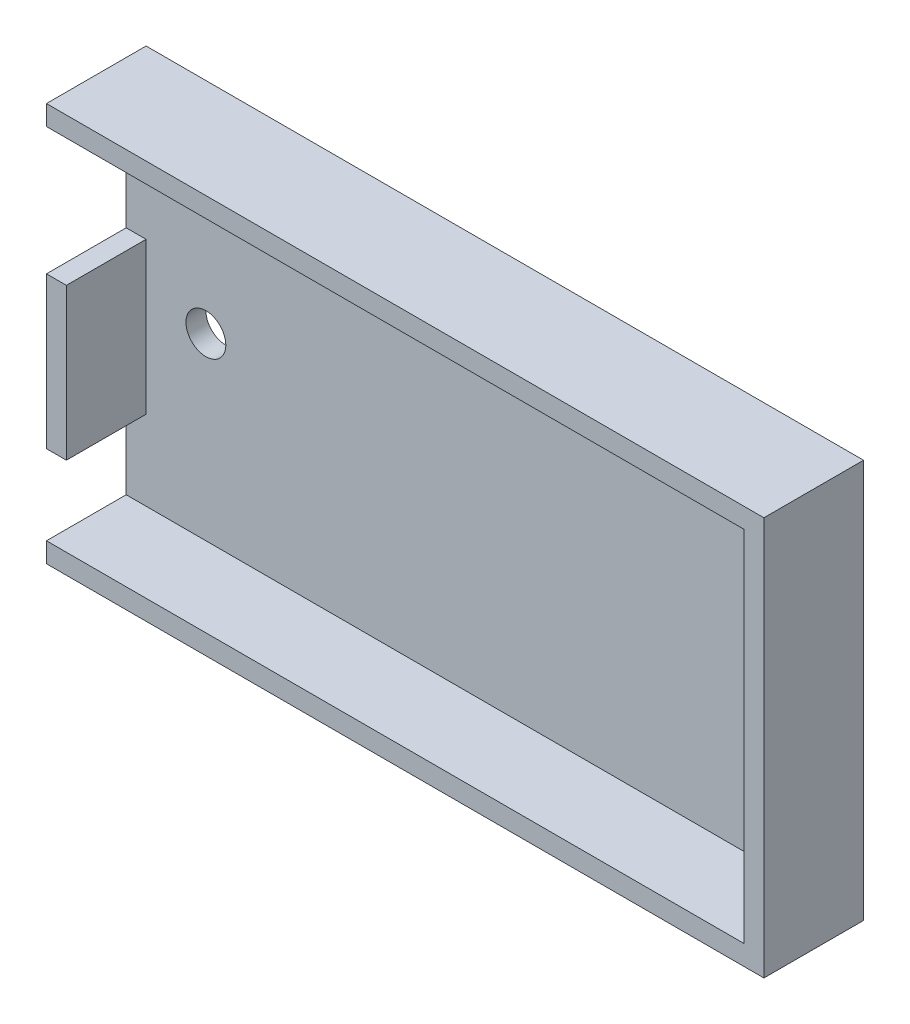
ISO-10303-21;
HEADER;
FILE_DESCRIPTION(('STEP AP214'),'2;1');
FILE_NAME('part.step','',(''),(''),'','','');
FILE_SCHEMA(('AUTOMOTIVE_DESIGN { 1 0 10303 214 1 1 1 1 }'));
ENDSEC;
DATA;
#1=APPLICATION_CONTEXT('core data for automotive mechanical design processes');
#2=APPLICATION_PROTOCOL_DEFINITION('international standard','automotive_design',2000,#1);
#3=PRODUCT_CONTEXT('',#1,'mechanical');
#4=PRODUCT('Part','Part','',(#3));
#5=PRODUCT_RELATED_PRODUCT_CATEGORY('part','',(#4));
#6=PRODUCT_DEFINITION_FORMATION('','',#4);
#7=PRODUCT_DEFINITION_CONTEXT('part definition',#1,'design');
#8=PRODUCT_DEFINITION('design','',#6,#7);
#9=PRODUCT_DEFINITION_SHAPE('','',#8);
#10=(LENGTH_UNIT() NAMED_UNIT(*) SI_UNIT(.MILLI.,.METRE.));
#11=(NAMED_UNIT(*) PLANE_ANGLE_UNIT() SI_UNIT($,.RADIAN.));
#12=(NAMED_UNIT(*) SI_UNIT($,.STERADIAN.) SOLID_ANGLE_UNIT());
#13=UNCERTAINTY_MEASURE_WITH_UNIT(LENGTH_MEASURE(1.E-05),#10,'distance_accuracy_value','');
#14=(GEOMETRIC_REPRESENTATION_CONTEXT(3) GLOBAL_UNCERTAINTY_ASSIGNED_CONTEXT((#13)) GLOBAL_UNIT_ASSIGNED_CONTEXT((#10,
#11,#12)) REPRESENTATION_CONTEXT('',''));
#15=CARTESIAN_POINT('',(0.,0.,0.));
#16=DIRECTION('',(0.,0.,1.));
#17=DIRECTION('',(1.,0.,0.));
#18=AXIS2_PLACEMENT_3D('',#15,#16,#17);
#19=CARTESIAN_POINT('',(0.,0.,15.875));
#20=DIRECTION('',(0.,0.,1.));
#21=DIRECTION('',(1.,0.,0.));
#22=AXIS2_PLACEMENT_3D('',#19,#20,#21);
#23=PLANE('',#22);
#24=DIRECTION('',(-1.,0.,0.));
#25=VECTOR('',#24,1.);
#26=CARTESIAN_POINT('',(57.151,-15.875,15.875));
#27=LINE('',#26,#25);
#28=CARTESIAN_POINT('',(-53.975,-15.875,15.875));
#29=VERTEX_POINT('',#28);
#30=CARTESIAN_POINT('',(-57.15,-15.875,15.875));
#31=VERTEX_POINT('',#30);
#32=EDGE_CURVE('E128',#29,#31,#27,.T.);
#33=ORIENTED_EDGE('',*,*,#32,.F.);
#34=DIRECTION('',(0.,-1.,0.));
#35=VECTOR('',#34,1.);
#36=CARTESIAN_POINT('',(-53.975,28.575,15.875));
#37=LINE('',#36,#35);
#38=CARTESIAN_POINT('',(-53.975,8.255,15.875));
#39=VERTEX_POINT('',#38);
#40=EDGE_CURVE('E140',#39,#29,#37,.T.);
#41=ORIENTED_EDGE('',*,*,#40,.F.);
#42=DIRECTION('',(-1.,0.,0.));
#43=VECTOR('',#42,1.);
#44=CARTESIAN_POINT('',(57.151,8.255,15.875));
#45=LINE('',#44,#43);
#46=CARTESIAN_POINT('',(-57.15,8.255,15.875));
#47=VERTEX_POINT('',#46);
#48=EDGE_CURVE('E234',#39,#47,#45,.T.);
#49=ORIENTED_EDGE('',*,*,#48,.T.);
#50=DIRECTION('',(0.,-1.,0.));
#51=VECTOR('',#50,1.);
#52=CARTESIAN_POINT('',(-57.15,31.75,15.875));
#53=LINE('',#52,#51);
#54=EDGE_CURVE('E142',#47,#31,#53,.T.);
#55=ORIENTED_EDGE('',*,*,#54,.T.);
#56=EDGE_LOOP('',(#33,#41,#49,#55));
#57=FACE_BOUND('',#56,.T.);
#58=ADVANCED_FACE('F34',(#57),#23,.T.);
#59=CARTESIAN_POINT('',(57.15,-31.75,3.175));
#60=DIRECTION('',(-1.,0.,0.));
#61=DIRECTION('',(0.,0.,1.));
#62=AXIS2_PLACEMENT_3D('',#59,#60,#61);
#63=PLANE('',#62);
#64=DIRECTION('',(0.,1.,0.));
#65=VECTOR('',#64,1.);
#66=CARTESIAN_POINT('',(57.15,-31.75,0.));
#67=LINE('',#66,#65);
#68=CARTESIAN_POINT('',(57.15,-31.75,0.));
#69=VERTEX_POINT('',#68);
#70=CARTESIAN_POINT('',(57.15,31.75,0.));
#71=VERTEX_POINT('',#70);
#72=EDGE_CURVE('E182',#69,#71,#67,.T.);
#73=ORIENTED_EDGE('',*,*,#72,.T.);
#74=DIRECTION('',(0.,0.,-1.));
#75=VECTOR('',#74,1.);
#76=CARTESIAN_POINT('',(57.15,31.75,3.175));
#77=LINE('',#76,#75);
#78=CARTESIAN_POINT('',(57.15,31.75,15.875));
#79=VERTEX_POINT('',#78);
#80=EDGE_CURVE('E11',#79,#71,#77,.T.);
#81=ORIENTED_EDGE('',*,*,#80,.F.);
#82=DIRECTION('',(0.,1.,0.));
#83=VECTOR('',#82,1.);
#84=CARTESIAN_POINT('',(57.15,-31.75,15.875));
#85=LINE('',#84,#83);
#86=CARTESIAN_POINT('',(57.15,-31.75,15.875));
#87=VERTEX_POINT('',#86);
#88=EDGE_CURVE('E176',#87,#79,#85,.T.);
#89=ORIENTED_EDGE('',*,*,#88,.F.);
#90=DIRECTION('',(0.,0.,-1.));
#91=VECTOR('',#90,1.);
#92=CARTESIAN_POINT('',(57.15,-31.75,3.175));
#93=LINE('',#92,#91);
#94=EDGE_CURVE('E190',#87,#69,#93,.T.);
#95=ORIENTED_EDGE('',*,*,#94,.T.);
#96=EDGE_LOOP('',(#73,#81,#89,#95));
#97=FACE_BOUND('',#96,.T.);
#98=ADVANCED_FACE('F36',(#97),#63,.F.);
#99=CARTESIAN_POINT('',(-57.15,31.75,3.175));
#100=DIRECTION('',(0.,-1.,0.));
#101=DIRECTION('',(0.,0.,-1.));
#102=AXIS2_PLACEMENT_3D('',#99,#100,#101);
#103=PLANE('',#102);
#104=DIRECTION('',(-1.,0.,0.));
#105=VECTOR('',#104,1.);
#106=CARTESIAN_POINT('',(-57.15,31.75,0.));
#107=LINE('',#106,#105);
#108=CARTESIAN_POINT('',(-57.15,31.75,0.));
#109=VERTEX_POINT('',#108);
#110=EDGE_CURVE('E185',#71,#109,#107,.T.);
#111=ORIENTED_EDGE('',*,*,#110,.T.);
#112=DIRECTION('',(0.,0.,-1.));
#113=VECTOR('',#112,1.);
#114=CARTESIAN_POINT('',(-57.15,31.75,3.175));
#115=LINE('',#114,#113);
#116=CARTESIAN_POINT('',(-57.15,31.75,15.875));
#117=VERTEX_POINT('',#116);
#118=EDGE_CURVE('E42',#117,#109,#115,.T.);
#119=ORIENTED_EDGE('',*,*,#118,.F.);
#120=DIRECTION('',(-1.,0.,0.));
#121=VECTOR('',#120,1.);
#122=CARTESIAN_POINT('',(57.15,31.75,15.875));
#123=LINE('',#122,#121);
#124=EDGE_CURVE('E179',#79,#117,#123,.T.);
#125=ORIENTED_EDGE('',*,*,#124,.F.);
#126=ORIENTED_EDGE('',*,*,#80,.T.);
#127=EDGE_LOOP('',(#111,#119,#125,#126));
#128=FACE_BOUND('',#127,.T.);
#129=ADVANCED_FACE('F245',(#128),#103,.F.);
#130=CARTESIAN_POINT('',(-57.15,-31.75,3.175));
#131=DIRECTION('',(1.,0.,0.));
#132=DIRECTION('',(0.,0.,-1.));
#133=AXIS2_PLACEMENT_3D('',#130,#131,#132);
#134=PLANE('',#133);
#135=DIRECTION('',(0.,-1.,0.));
#136=VECTOR('',#135,1.);
#137=CARTESIAN_POINT('',(-57.15,-28.575,3.175));
#138=LINE('',#137,#136);
#139=CARTESIAN_POINT('',(-57.15,-15.875,3.175));
#140=VERTEX_POINT('',#139);
#141=CARTESIAN_POINT('',(-57.15,-28.575,3.175));
#142=VERTEX_POINT('',#141);
#143=EDGE_CURVE('E217',#140,#142,#138,.T.);
#144=ORIENTED_EDGE('',*,*,#143,.F.);
#145=DIRECTION('',(0.,0.,-1.));
#146=VECTOR('',#145,1.);
#147=CARTESIAN_POINT('',(-57.15,-15.875,15.875));
#148=LINE('',#147,#146);
#149=EDGE_CURVE('E220',#31,#140,#148,.T.);
#150=ORIENTED_EDGE('',*,*,#149,.F.);
#151=ORIENTED_EDGE('',*,*,#54,.F.);
#152=DIRECTION('',(0.,0.,1.));
#153=VECTOR('',#152,1.);
#154=CARTESIAN_POINT('',(-57.15,8.255,15.875));
#155=LINE('',#154,#153);
#156=CARTESIAN_POINT('',(-57.15,8.255,3.175));
#157=VERTEX_POINT('',#156);
#158=EDGE_CURVE('E232',#157,#47,#155,.T.);
#159=ORIENTED_EDGE('',*,*,#158,.F.);
#160=DIRECTION('',(0.,-1.,0.));
#161=VECTOR('',#160,1.);
#162=CARTESIAN_POINT('',(-57.15,28.575,3.175));
#163=LINE('',#162,#161);
#164=CARTESIAN_POINT('',(-57.15,28.575,3.175));
#165=VERTEX_POINT('',#164);
#166=EDGE_CURVE('E230',#165,#157,#163,.T.);
#167=ORIENTED_EDGE('',*,*,#166,.F.);
#168=DIRECTION('',(0.,0.,-1.));
#169=VECTOR('',#168,1.);
#170=CARTESIAN_POINT('',(-57.15,28.575,15.875));
#171=LINE('',#170,#169);
#172=CARTESIAN_POINT('',(-57.15,28.575,15.875));
#173=VERTEX_POINT('',#172);
#174=EDGE_CURVE('E226',#173,#165,#171,.T.);
#175=ORIENTED_EDGE('',*,*,#174,.F.);
#176=EDGE_CURVE('E170',#117,#173,#53,.T.);
#177=ORIENTED_EDGE('',*,*,#176,.F.);
#178=ORIENTED_EDGE('',*,*,#118,.T.);
#179=DIRECTION('',(0.,-1.,0.));
#180=VECTOR('',#179,1.);
#181=CARTESIAN_POINT('',(-57.15,-31.75,0.));
#182=LINE('',#181,#180);
#183=CARTESIAN_POINT('',(-57.15,-31.75,0.));
#184=VERTEX_POINT('',#183);
#185=EDGE_CURVE('E187',#109,#184,#182,.T.);
#186=ORIENTED_EDGE('',*,*,#185,.T.);
#187=DIRECTION('',(0.,0.,-1.));
#188=VECTOR('',#187,1.);
#189=CARTESIAN_POINT('',(-57.15,-31.75,3.175));
#190=LINE('',#189,#188);
#191=CARTESIAN_POINT('',(-57.15,-31.75,15.875));
#192=VERTEX_POINT('',#191);
#193=EDGE_CURVE('E192',#192,#184,#190,.T.);
#194=ORIENTED_EDGE('',*,*,#193,.F.);
#195=CARTESIAN_POINT('',(-57.15,-28.575,15.875));
#196=VERTEX_POINT('',#195);
#197=EDGE_CURVE('E169',#196,#192,#53,.T.);
#198=ORIENTED_EDGE('',*,*,#197,.F.);
#199=DIRECTION('',(0.,0.,1.));
#200=VECTOR('',#199,1.);
#201=CARTESIAN_POINT('',(-57.15,-28.575,15.875));
#202=LINE('',#201,#200);
#203=EDGE_CURVE('E143',#142,#196,#202,.T.);
#204=ORIENTED_EDGE('',*,*,#203,.F.);
#205=EDGE_LOOP('',(#144,#150,#151,#159,#167,#175,#177,#178,#186,#194,#198,#204));
#206=FACE_BOUND('',#205,.T.);
#207=ADVANCED_FACE('F198',(#206),#134,.F.);
#208=CARTESIAN_POINT('',(-57.15,-31.75,3.175));
#209=DIRECTION('',(0.,1.,0.));
#210=DIRECTION('',(0.,0.,1.));
#211=AXIS2_PLACEMENT_3D('',#208,#209,#210);
#212=PLANE('',#211);
#213=DIRECTION('',(1.,0.,0.));
#214=VECTOR('',#213,1.);
#215=CARTESIAN_POINT('',(-57.15,-31.75,0.));
#216=LINE('',#215,#214);
#217=EDGE_CURVE('E57',#184,#69,#216,.T.);
#218=ORIENTED_EDGE('',*,*,#217,.T.);
#219=ORIENTED_EDGE('',*,*,#94,.F.);
#220=DIRECTION('',(1.,0.,0.));
#221=VECTOR('',#220,1.);
#222=CARTESIAN_POINT('',(-57.15,-31.75,15.875));
#223=LINE('',#222,#221);
#224=EDGE_CURVE('E173',#192,#87,#223,.T.);
#225=ORIENTED_EDGE('',*,*,#224,.F.);
#226=ORIENTED_EDGE('',*,*,#193,.T.);
#227=EDGE_LOOP('',(#218,#219,#225,#226));
#228=FACE_BOUND('',#227,.T.);
#229=ADVANCED_FACE('F209',(#228),#212,.F.);
#230=CARTESIAN_POINT('',(0.,0.,0.));
#231=DIRECTION('',(0.,0.,-1.));
#232=DIRECTION('',(-1.,0.,0.));
#233=AXIS2_PLACEMENT_3D('',#230,#231,#232);
#234=PLANE('',#233);
#235=CARTESIAN_POINT('',(-44.45,0.,0.));
#236=DIRECTION('',(0.,0.,-1.));
#237=DIRECTION('',(-1.,0.,0.));
#238=AXIS2_PLACEMENT_3D('',#235,#236,#237);
#239=CIRCLE('',#238,3.175);
#240=CARTESIAN_POINT('',(-47.625,0.,0.));
#241=VERTEX_POINT('',#240);
#242=EDGE_CURVE('E296',#241,#241,#239,.F.);
#243=ORIENTED_EDGE('',*,*,#242,.T.);
#244=EDGE_LOOP('',(#243));
#245=FACE_BOUND('',#244,.T.);
#246=CARTESIAN_POINT('',(44.45,0.,0.));
#247=DIRECTION('',(0.,0.,-1.));
#248=DIRECTION('',(-1.,0.,0.));
#249=AXIS2_PLACEMENT_3D('',#246,#247,#248);
#250=CIRCLE('',#249,3.17500000000001);
#251=CARTESIAN_POINT('',(41.275,0.,0.));
#252=VERTEX_POINT('',#251);
#253=EDGE_CURVE('E292',#252,#252,#250,.F.);
#254=ORIENTED_EDGE('',*,*,#253,.T.);
#255=EDGE_LOOP('',(#254));
#256=FACE_BOUND('',#255,.T.);
#257=ORIENTED_EDGE('',*,*,#72,.F.);
#258=ORIENTED_EDGE('',*,*,#217,.F.);
#259=ORIENTED_EDGE('',*,*,#185,.F.);
#260=ORIENTED_EDGE('',*,*,#110,.F.);
#261=EDGE_LOOP('',(#257,#258,#259,#260));
#262=FACE_BOUND('',#261,.T.);
#263=ADVANCED_FACE('F205',(#245,#256,#262),#234,.T.);
#264=DIRECTION('',(1.,0.,0.));
#265=VECTOR('',#264,1.);
#266=CARTESIAN_POINT('',(-53.975,-28.575,15.875));
#267=LINE('',#266,#265);
#268=CARTESIAN_POINT('',(53.975,-28.575,15.875));
#269=VERTEX_POINT('',#268);
#270=EDGE_CURVE('E165',#196,#269,#267,.T.);
#271=ORIENTED_EDGE('',*,*,#270,.F.);
#272=ORIENTED_EDGE('',*,*,#197,.T.);
#273=ORIENTED_EDGE('',*,*,#224,.T.);
#274=ORIENTED_EDGE('',*,*,#88,.T.);
#275=ORIENTED_EDGE('',*,*,#124,.T.);
#276=ORIENTED_EDGE('',*,*,#176,.T.);
#277=DIRECTION('',(-1.,0.,0.));
#278=VECTOR('',#277,1.);
#279=CARTESIAN_POINT('',(53.975,28.575,15.875));
#280=LINE('',#279,#278);
#281=CARTESIAN_POINT('',(53.975,28.575,15.875));
#282=VERTEX_POINT('',#281);
#283=EDGE_CURVE('E149',#282,#173,#280,.T.);
#284=ORIENTED_EDGE('',*,*,#283,.F.);
#285=DIRECTION('',(0.,1.,0.));
#286=VECTOR('',#285,1.);
#287=CARTESIAN_POINT('',(53.975,-28.575,15.875));
#288=LINE('',#287,#286);
#289=EDGE_CURVE('E153',#269,#282,#288,.T.);
#290=ORIENTED_EDGE('',*,*,#289,.F.);
#291=EDGE_LOOP('',(#271,#272,#273,#274,#275,#276,#284,#290));
#292=FACE_BOUND('',#291,.T.);
#293=ADVANCED_FACE('F211',(#292),#23,.T.);
#294=CARTESIAN_POINT('',(-53.975,-28.575,15.875));
#295=DIRECTION('',(0.,1.,0.));
#296=DIRECTION('',(0.,0.,1.));
#297=AXIS2_PLACEMENT_3D('',#294,#295,#296);
#298=PLANE('',#297);
#299=DIRECTION('',(1.,0.,0.));
#300=VECTOR('',#299,1.);
#301=CARTESIAN_POINT('',(-53.975,-28.575,3.175));
#302=LINE('',#301,#300);
#303=CARTESIAN_POINT('',(53.975,-28.575,3.175));
#304=VERTEX_POINT('',#303);
#305=EDGE_CURVE('E134',#142,#304,#302,.T.);
#306=ORIENTED_EDGE('',*,*,#305,.F.);
#307=ORIENTED_EDGE('',*,*,#203,.T.);
#308=ORIENTED_EDGE('',*,*,#270,.T.);
#309=DIRECTION('',(0.,0.,-1.));
#310=VECTOR('',#309,1.);
#311=CARTESIAN_POINT('',(53.975,-28.575,15.875));
#312=LINE('',#311,#310);
#313=EDGE_CURVE('E151',#269,#304,#312,.T.);
#314=ORIENTED_EDGE('',*,*,#313,.T.);
#315=EDGE_LOOP('',(#306,#307,#308,#314));
#316=FACE_BOUND('',#315,.T.);
#317=ADVANCED_FACE('F259',(#316),#298,.T.);
#318=CARTESIAN_POINT('',(53.975,-28.575,15.875));
#319=DIRECTION('',(-1.,0.,0.));
#320=DIRECTION('',(0.,0.,1.));
#321=AXIS2_PLACEMENT_3D('',#318,#319,#320);
#322=PLANE('',#321);
#323=DIRECTION('',(0.,1.,0.));
#324=VECTOR('',#323,1.);
#325=CARTESIAN_POINT('',(53.975,-28.575,3.175));
#326=LINE('',#325,#324);
#327=CARTESIAN_POINT('',(53.975,28.575,3.175));
#328=VERTEX_POINT('',#327);
#329=EDGE_CURVE('E159',#304,#328,#326,.T.);
#330=ORIENTED_EDGE('',*,*,#329,.F.);
#331=ORIENTED_EDGE('',*,*,#313,.F.);
#332=ORIENTED_EDGE('',*,*,#289,.T.);
#333=DIRECTION('',(0.,0.,-1.));
#334=VECTOR('',#333,1.);
#335=CARTESIAN_POINT('',(53.975,28.575,15.875));
#336=LINE('',#335,#334);
#337=EDGE_CURVE('E148',#282,#328,#336,.T.);
#338=ORIENTED_EDGE('',*,*,#337,.T.);
#339=EDGE_LOOP('',(#330,#331,#332,#338));
#340=FACE_BOUND('',#339,.T.);
#341=ADVANCED_FACE('F240',(#340),#322,.T.);
#342=CARTESIAN_POINT('',(53.975,28.575,15.875));
#343=DIRECTION('',(0.,-1.,0.));
#344=DIRECTION('',(0.,0.,-1.));
#345=AXIS2_PLACEMENT_3D('',#342,#343,#344);
#346=PLANE('',#345);
#347=DIRECTION('',(-1.,0.,0.));
#348=VECTOR('',#347,1.);
#349=CARTESIAN_POINT('',(53.975,28.575,3.175));
#350=LINE('',#349,#348);
#351=EDGE_CURVE('E162',#328,#165,#350,.T.);
#352=ORIENTED_EDGE('',*,*,#351,.F.);
#353=ORIENTED_EDGE('',*,*,#337,.F.);
#354=ORIENTED_EDGE('',*,*,#283,.T.);
#355=ORIENTED_EDGE('',*,*,#174,.T.);
#356=EDGE_LOOP('',(#352,#353,#354,#355));
#357=FACE_BOUND('',#356,.T.);
#358=ADVANCED_FACE('F244',(#357),#346,.T.);
#359=CARTESIAN_POINT('',(-53.975,28.575,15.875));
#360=DIRECTION('',(1.,0.,0.));
#361=DIRECTION('',(0.,0.,-1.));
#362=AXIS2_PLACEMENT_3D('',#359,#360,#361);
#363=PLANE('',#362);
#364=DIRECTION('',(0.,0.,-1.));
#365=VECTOR('',#364,1.);
#366=CARTESIAN_POINT('',(-53.975,-15.875,15.875));
#367=LINE('',#366,#365);
#368=CARTESIAN_POINT('',(-53.975,-15.875,3.175));
#369=VERTEX_POINT('',#368);
#370=EDGE_CURVE('E124',#29,#369,#367,.T.);
#371=ORIENTED_EDGE('',*,*,#370,.T.);
#372=DIRECTION('',(0.,-1.,0.));
#373=VECTOR('',#372,1.);
#374=CARTESIAN_POINT('',(-53.975,28.575,3.175));
#375=LINE('',#374,#373);
#376=CARTESIAN_POINT('',(-53.975,8.255,3.175));
#377=VERTEX_POINT('',#376);
#378=EDGE_CURVE('E164',#377,#369,#375,.T.);
#379=ORIENTED_EDGE('',*,*,#378,.F.);
#380=DIRECTION('',(0.,0.,1.));
#381=VECTOR('',#380,1.);
#382=CARTESIAN_POINT('',(-53.975,8.255,15.875));
#383=LINE('',#382,#381);
#384=EDGE_CURVE('E147',#377,#39,#383,.T.);
#385=ORIENTED_EDGE('',*,*,#384,.T.);
#386=ORIENTED_EDGE('',*,*,#40,.T.);
#387=EDGE_LOOP('',(#371,#379,#385,#386));
#388=FACE_BOUND('',#387,.T.);
#389=ADVANCED_FACE('F146',(#388),#363,.T.);
#390=CARTESIAN_POINT('',(0.,0.,3.175));
#391=DIRECTION('',(0.,0.,-1.));
#392=DIRECTION('',(-1.,0.,0.));
#393=AXIS2_PLACEMENT_3D('',#390,#391,#392);
#394=PLANE('',#393);
#395=CARTESIAN_POINT('',(-44.45,0.,3.175));
#396=DIRECTION('',(0.,0.,1.));
#397=DIRECTION('',(1.,0.,0.));
#398=AXIS2_PLACEMENT_3D('',#395,#396,#397);
#399=CIRCLE('',#398,3.175);
#400=CARTESIAN_POINT('',(-41.275,0.,3.175));
#401=VERTEX_POINT('',#400);
#402=EDGE_CURVE('E227',#401,#401,#399,.T.);
#403=ORIENTED_EDGE('',*,*,#402,.F.);
#404=EDGE_LOOP('',(#403));
#405=FACE_BOUND('',#404,.T.);
#406=CARTESIAN_POINT('',(44.45,0.,3.175));
#407=DIRECTION('',(0.,0.,1.));
#408=DIRECTION('',(1.,0.,0.));
#409=AXIS2_PLACEMENT_3D('',#406,#407,#408);
#410=CIRCLE('',#409,3.17500000000001);
#411=CARTESIAN_POINT('',(47.625,0.,3.175));
#412=VERTEX_POINT('',#411);
#413=EDGE_CURVE('E288',#412,#412,#410,.T.);
#414=ORIENTED_EDGE('',*,*,#413,.F.);
#415=EDGE_LOOP('',(#414));
#416=FACE_BOUND('',#415,.T.);
#417=ORIENTED_EDGE('',*,*,#351,.T.);
#418=ORIENTED_EDGE('',*,*,#166,.T.);
#419=DIRECTION('',(-1.,0.,0.));
#420=VECTOR('',#419,1.);
#421=CARTESIAN_POINT('',(57.151,8.255,3.175));
#422=LINE('',#421,#420);
#423=EDGE_CURVE('E49',#377,#157,#422,.T.);
#424=ORIENTED_EDGE('',*,*,#423,.F.);
#425=ORIENTED_EDGE('',*,*,#378,.T.);
#426=DIRECTION('',(-1.,0.,0.));
#427=VECTOR('',#426,1.);
#428=CARTESIAN_POINT('',(57.151,-15.875,3.175));
#429=LINE('',#428,#427);
#430=EDGE_CURVE('E130',#369,#140,#429,.T.);
#431=ORIENTED_EDGE('',*,*,#430,.T.);
#432=ORIENTED_EDGE('',*,*,#143,.T.);
#433=ORIENTED_EDGE('',*,*,#305,.T.);
#434=ORIENTED_EDGE('',*,*,#329,.T.);
#435=EDGE_LOOP('',(#417,#418,#424,#425,#431,#432,#433,#434));
#436=FACE_BOUND('',#435,.T.);
#437=ADVANCED_FACE('F272',(#405,#416,#436),#394,.F.);
#438=CARTESIAN_POINT('',(57.151,8.255,15.875));
#439=DIRECTION('',(0.,-1.,0.));
#440=DIRECTION('',(0.,0.,-1.));
#441=AXIS2_PLACEMENT_3D('',#438,#439,#440);
#442=PLANE('',#441);
#443=ORIENTED_EDGE('',*,*,#423,.T.);
#444=ORIENTED_EDGE('',*,*,#158,.T.);
#445=ORIENTED_EDGE('',*,*,#48,.F.);
#446=ORIENTED_EDGE('',*,*,#384,.F.);
#447=EDGE_LOOP('',(#443,#444,#445,#446));
#448=FACE_BOUND('',#447,.T.);
#449=ADVANCED_FACE('F274',(#448),#442,.F.);
#450=CARTESIAN_POINT('',(57.151,-15.875,15.875));
#451=DIRECTION('',(0.,1.,0.));
#452=DIRECTION('',(0.,0.,1.));
#453=AXIS2_PLACEMENT_3D('',#450,#451,#452);
#454=PLANE('',#453);
#455=ORIENTED_EDGE('',*,*,#32,.T.);
#456=ORIENTED_EDGE('',*,*,#149,.T.);
#457=ORIENTED_EDGE('',*,*,#430,.F.);
#458=ORIENTED_EDGE('',*,*,#370,.F.);
#459=EDGE_LOOP('',(#455,#456,#457,#458));
#460=FACE_BOUND('',#459,.T.);
#461=ADVANCED_FACE('F126',(#460),#454,.F.);
#462=CARTESIAN_POINT('',(44.45,0.,-0.00100000000000013));
#463=DIRECTION('',(0.,0.,1.));
#464=DIRECTION('',(1.,0.,0.));
#465=AXIS2_PLACEMENT_3D('',#462,#463,#464);
#466=CYLINDRICAL_SURFACE('',#465,3.17500000000001);
#467=ORIENTED_EDGE('',*,*,#253,.F.);
#468=EDGE_LOOP('',(#467));
#469=FACE_BOUND('',#468,.T.);
#470=ORIENTED_EDGE('',*,*,#413,.T.);
#471=EDGE_LOOP('',(#470));
#472=FACE_BOUND('',#471,.T.);
#473=ADVANCED_FACE('F301',(#469,#472),#466,.F.);
#474=CARTESIAN_POINT('',(-44.45,0.,-0.00100000000000013));
#475=DIRECTION('',(0.,0.,1.));
#476=DIRECTION('',(1.,0.,0.));
#477=AXIS2_PLACEMENT_3D('',#474,#475,#476);
#478=CYLINDRICAL_SURFACE('',#477,3.175);
#479=ORIENTED_EDGE('',*,*,#242,.F.);
#480=EDGE_LOOP('',(#479));
#481=FACE_BOUND('',#480,.T.);
#482=ORIENTED_EDGE('',*,*,#402,.T.);
#483=EDGE_LOOP('',(#482));
#484=FACE_BOUND('',#483,.T.);
#485=ADVANCED_FACE('F299',(#481,#484),#478,.F.);
#486=CLOSED_SHELL('',(#58,#98,#129,#207,#229,#263,#293,#317,#341,#358,#389,#437,#449,#461,#473,#485));
#487=MANIFOLD_SOLID_BREP('B2',#486);
#488=ADVANCED_BREP_SHAPE_REPRESENTATION('',(#18,#487),#14);
#489=SHAPE_DEFINITION_REPRESENTATION(#9,#488);
ENDSEC;
END-ISO-10303-21;
